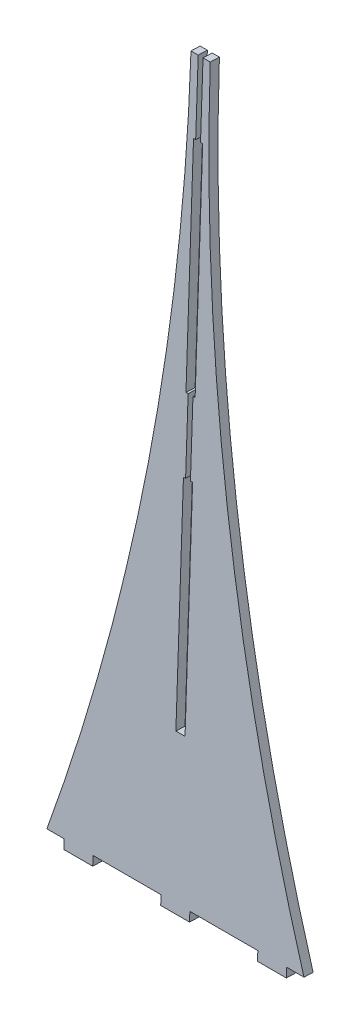
ISO-10303-21;
HEADER;
FILE_DESCRIPTION(('STEP AP214'),'2;1');
FILE_NAME('part.step','',(''),(''),'','','');
FILE_SCHEMA(('AUTOMOTIVE_DESIGN { 1 0 10303 214 1 1 1 1 }'));
ENDSEC;
DATA;
#1=APPLICATION_CONTEXT('core data for automotive mechanical design processes');
#2=APPLICATION_PROTOCOL_DEFINITION('international standard','automotive_design',2000,#1);
#3=PRODUCT_CONTEXT('',#1,'mechanical');
#4=PRODUCT('Part','Part','',(#3));
#5=PRODUCT_RELATED_PRODUCT_CATEGORY('part','',(#4));
#6=PRODUCT_DEFINITION_FORMATION('','',#4);
#7=PRODUCT_DEFINITION_CONTEXT('part definition',#1,'design');
#8=PRODUCT_DEFINITION('design','',#6,#7);
#9=PRODUCT_DEFINITION_SHAPE('','',#8);
#10=(LENGTH_UNIT() NAMED_UNIT(*) SI_UNIT(.MILLI.,.METRE.));
#11=(NAMED_UNIT(*) PLANE_ANGLE_UNIT() SI_UNIT($,.RADIAN.));
#12=(NAMED_UNIT(*) SI_UNIT($,.STERADIAN.) SOLID_ANGLE_UNIT());
#13=UNCERTAINTY_MEASURE_WITH_UNIT(LENGTH_MEASURE(1.E-05),#10,'distance_accuracy_value','');
#14=(GEOMETRIC_REPRESENTATION_CONTEXT(3) GLOBAL_UNCERTAINTY_ASSIGNED_CONTEXT((#13)) GLOBAL_UNIT_ASSIGNED_CONTEXT((#10,
#11,#12)) REPRESENTATION_CONTEXT('',''));
#15=CARTESIAN_POINT('',(0.,0.,0.));
#16=DIRECTION('',(0.,0.,1.));
#17=DIRECTION('',(1.,0.,0.));
#18=AXIS2_PLACEMENT_3D('',#15,#16,#17);
#19=CARTESIAN_POINT('',(-5.,-2.53322773530518,-72.4814190354541));
#20=DIRECTION('',(1.,0.,0.));
#21=DIRECTION('',(0.,0.,-1.));
#22=AXIS2_PLACEMENT_3D('',#19,#20,#21);
#23=PLANE('',#22);
#24=DIRECTION('',(0.,0.999389806676678,-0.0349287032503637));
#25=VECTOR('',#24,1.);
#26=CARTESIAN_POINT('',(-5.,-2.42232910248527,-69.3083563992557));
#27=LINE('',#26,#25);
#28=CARTESIAN_POINT('',(-5.,73.5709190938813,-71.9643226674216));
#29=VERTEX_POINT('',#28);
#30=CARTESIAN_POINT('',(-5.,76.7439817300797,-72.0752213002415));
#31=VERTEX_POINT('',#30);
#32=EDGE_CURVE('E278',#29,#31,#27,.T.);
#33=ORIENTED_EDGE('',*,*,#32,.T.);
#34=DIRECTION('',(0.,0.0349287032503637,0.999389806676678));
#35=VECTOR('',#34,1.);
#36=CARTESIAN_POINT('',(-5.,76.6330830972598,-75.24828393644));
#37=LINE('',#36,#35);
#38=CARTESIAN_POINT('',(-5.,76.6330830972598,-75.24828393644));
#39=VERTEX_POINT('',#38);
#40=EDGE_CURVE('E11',#39,#31,#37,.T.);
#41=ORIENTED_EDGE('',*,*,#40,.F.);
#42=DIRECTION('',(0.,0.999389806676678,-0.0349287032503637));
#43=VECTOR('',#42,1.);
#44=CARTESIAN_POINT('',(-5.,-2.53322773530518,-72.4814190354541));
#45=LINE('',#44,#43);
#46=CARTESIAN_POINT('',(-5.,73.4600204610614,-75.1373853036201));
#47=VERTEX_POINT('',#46);
#48=EDGE_CURVE('E352',#47,#39,#45,.T.);
#49=ORIENTED_EDGE('',*,*,#48,.F.);
#50=DIRECTION('',(0.,0.0349287032503637,0.999389806676678));
#51=VECTOR('',#50,1.);
#52=CARTESIAN_POINT('',(-5.,73.4600204610614,-75.1373853036201));
#53=LINE('',#52,#51);
#54=EDGE_CURVE('E273',#47,#29,#53,.T.);
#55=ORIENTED_EDGE('',*,*,#54,.T.);
#56=EDGE_LOOP('',(#33,#41,#49,#55));
#57=FACE_BOUND('',#56,.T.);
#58=ADVANCED_FACE('F36',(#57),#23,.F.);
#59=CARTESIAN_POINT('',(0.,76.6330830972598,-75.24828393644));
#60=DIRECTION('',(0.,0.999389806676678,-0.0349287032503637));
#61=DIRECTION('',(0.,0.0349287032503637,0.999389806676678));
#62=AXIS2_PLACEMENT_3D('',#59,#60,#61);
#63=PLANE('',#62);
#64=DIRECTION('',(-1.,0.,0.));
#65=VECTOR('',#64,1.);
#66=CARTESIAN_POINT('',(0.,76.7439817300797,-72.0752213002415));
#67=LINE('',#66,#65);
#68=CARTESIAN_POINT('',(-28.5714567803796,76.7439817300797,-72.0752213002415));
#69=VERTEX_POINT('',#68);
#70=EDGE_CURVE('E281',#31,#69,#67,.T.);
#71=ORIENTED_EDGE('',*,*,#70,.T.);
#72=DIRECTION('',(0.,0.0349287032503637,0.999389806676678));
#73=VECTOR('',#72,1.);
#74=CARTESIAN_POINT('',(-28.5714567803796,76.6330830972598,-75.24828393644));
#75=LINE('',#74,#73);
#76=CARTESIAN_POINT('',(-28.5714567803796,76.6330830972598,-75.24828393644));
#77=VERTEX_POINT('',#76);
#78=EDGE_CURVE('E44',#77,#69,#75,.T.);
#79=ORIENTED_EDGE('',*,*,#78,.F.);
#80=DIRECTION('',(-1.,0.,0.));
#81=VECTOR('',#80,1.);
#82=CARTESIAN_POINT('',(0.,76.6330830972598,-75.24828393644));
#83=LINE('',#82,#81);
#84=EDGE_CURVE('E167',#39,#77,#83,.T.);
#85=ORIENTED_EDGE('',*,*,#84,.F.);
#86=ORIENTED_EDGE('',*,*,#40,.T.);
#87=EDGE_LOOP('',(#71,#79,#85,#86));
#88=FACE_BOUND('',#87,.T.);
#89=ADVANCED_FACE('F426',(#88),#63,.F.);
#90=CARTESIAN_POINT('',(-28.5714567803796,-2.53322773530518,-72.4814190354541));
#91=DIRECTION('',(1.,0.,0.));
#92=DIRECTION('',(0.,0.,-1.));
#93=AXIS2_PLACEMENT_3D('',#90,#91,#92);
#94=PLANE('',#93);
#95=DIRECTION('',(0.,0.999389806676678,-0.0349287032503637));
#96=VECTOR('',#95,1.);
#97=CARTESIAN_POINT('',(-28.5714567803796,-2.42232910248527,-69.3083563992557));
#98=LINE('',#97,#96);
#99=CARTESIAN_POINT('',(-28.5714567803796,73.5709190938813,-71.9643226674216));
#100=VERTEX_POINT('',#99);
#101=EDGE_CURVE('E284',#100,#69,#98,.T.);
#102=ORIENTED_EDGE('',*,*,#101,.F.);
#103=DIRECTION('',(0.,0.0349287032503637,0.999389806676678));
#104=VECTOR('',#103,1.);
#105=CARTESIAN_POINT('',(-28.5714567803796,73.4600204610614,-75.1373853036201));
#106=LINE('',#105,#104);
#107=CARTESIAN_POINT('',(-28.5714567803796,73.4600204610614,-75.1373853036201));
#108=VERTEX_POINT('',#107);
#109=EDGE_CURVE('E419',#108,#100,#106,.T.);
#110=ORIENTED_EDGE('',*,*,#109,.F.);
#111=DIRECTION('',(0.,0.999389806676678,-0.0349287032503637));
#112=VECTOR('',#111,1.);
#113=CARTESIAN_POINT('',(-28.5714567803796,-2.53322773530518,-72.4814190354541));
#114=LINE('',#113,#112);
#115=EDGE_CURVE('E425',#108,#77,#114,.T.);
#116=ORIENTED_EDGE('',*,*,#115,.T.);
#117=ORIENTED_EDGE('',*,*,#78,.T.);
#118=EDGE_LOOP('',(#102,#110,#116,#117));
#119=FACE_BOUND('',#118,.T.);
#120=ADVANCED_FACE('F423',(#119),#94,.T.);
#121=CARTESIAN_POINT('',(0.,73.4600204610614,-75.1373853036201));
#122=DIRECTION('',(0.,-0.999389806676678,0.0349287032503637));
#123=DIRECTION('',(0.,-0.0349287032503637,-0.999389806676678));
#124=AXIS2_PLACEMENT_3D('',#121,#122,#123);
#125=PLANE('',#124);
#126=DIRECTION('',(1.,0.,0.));
#127=VECTOR('',#126,1.);
#128=CARTESIAN_POINT('',(0.,73.5709190938813,-71.9643226674216));
#129=LINE('',#128,#127);
#130=CARTESIAN_POINT('',(-38.5714567803796,73.5709190938813,-71.9643226674216));
#131=VERTEX_POINT('',#130);
#132=EDGE_CURVE('E288',#131,#100,#129,.T.);
#133=ORIENTED_EDGE('',*,*,#132,.F.);
#134=DIRECTION('',(0.,0.0349287032503637,0.999389806676678));
#135=VECTOR('',#134,1.);
#136=CARTESIAN_POINT('',(-38.5714567803796,73.4600204610614,-75.1373853036201));
#137=LINE('',#136,#135);
#138=CARTESIAN_POINT('',(-38.5714567803796,73.4600204610614,-75.1373853036201));
#139=VERTEX_POINT('',#138);
#140=EDGE_CURVE('E417',#139,#131,#137,.T.);
#141=ORIENTED_EDGE('',*,*,#140,.F.);
#142=DIRECTION('',(1.,0.,0.));
#143=VECTOR('',#142,1.);
#144=CARTESIAN_POINT('',(0.,73.4600204610614,-75.1373853036201));
#145=LINE('',#144,#143);
#146=EDGE_CURVE('E438',#139,#108,#145,.T.);
#147=ORIENTED_EDGE('',*,*,#146,.T.);
#148=ORIENTED_EDGE('',*,*,#109,.T.);
#149=EDGE_LOOP('',(#133,#141,#147,#148));
#150=FACE_BOUND('',#149,.T.);
#151=ADVANCED_FACE('F435',(#150),#125,.T.);
#152=CARTESIAN_POINT('',(-38.5714567803796,-2.53322773530518,-72.4814190354541));
#153=DIRECTION('',(-1.,0.,0.));
#154=DIRECTION('',(0.,0.,1.));
#155=AXIS2_PLACEMENT_3D('',#152,#153,#154);
#156=PLANE('',#155);
#157=DIRECTION('',(0.,-0.999389806676678,0.0349287032503637));
#158=VECTOR('',#157,1.);
#159=CARTESIAN_POINT('',(-38.5714567803796,-2.42232910248527,-69.3083563992557));
#160=LINE('',#159,#158);
#161=CARTESIAN_POINT('',(-38.5714567803796,76.7439817300797,-72.0752213002415));
#162=VERTEX_POINT('',#161);
#163=EDGE_CURVE('E291',#162,#131,#160,.T.);
#164=ORIENTED_EDGE('',*,*,#163,.F.);
#165=DIRECTION('',(0.,0.0349287032503637,0.999389806676678));
#166=VECTOR('',#165,1.);
#167=CARTESIAN_POINT('',(-38.5714567803796,76.6330830972598,-75.24828393644));
#168=LINE('',#167,#166);
#169=CARTESIAN_POINT('',(-38.5714567803796,76.6330830972598,-75.24828393644));
#170=VERTEX_POINT('',#169);
#171=EDGE_CURVE('E415',#170,#162,#168,.T.);
#172=ORIENTED_EDGE('',*,*,#171,.F.);
#173=DIRECTION('',(0.,-0.999389806676678,0.0349287032503637));
#174=VECTOR('',#173,1.);
#175=CARTESIAN_POINT('',(-38.5714567803796,-2.53322773530518,-72.4814190354541));
#176=LINE('',#175,#174);
#177=EDGE_CURVE('E442',#170,#139,#176,.T.);
#178=ORIENTED_EDGE('',*,*,#177,.T.);
#179=ORIENTED_EDGE('',*,*,#140,.T.);
#180=EDGE_LOOP('',(#164,#172,#178,#179));
#181=FACE_BOUND('',#180,.T.);
#182=ADVANCED_FACE('F533',(#181),#156,.T.);
#183=CARTESIAN_POINT('',(-44.5714567803795,76.7439817300797,-72.0752213002415));
#184=VERTEX_POINT('',#183);
#185=EDGE_CURVE('E285',#162,#184,#67,.T.);
#186=ORIENTED_EDGE('',*,*,#185,.T.);
#187=DIRECTION('',(0.,0.0349287032503637,0.999389806676678));
#188=VECTOR('',#187,1.);
#189=CARTESIAN_POINT('',(-44.5714567803795,76.6330830972598,-75.24828393644));
#190=LINE('',#189,#188);
#191=CARTESIAN_POINT('',(-44.5714567803795,76.6330830972598,-75.24828393644));
#192=VERTEX_POINT('',#191);
#193=EDGE_CURVE('E412',#192,#184,#190,.T.);
#194=ORIENTED_EDGE('',*,*,#193,.F.);
#195=EDGE_CURVE('E445',#170,#192,#83,.T.);
#196=ORIENTED_EDGE('',*,*,#195,.F.);
#197=ORIENTED_EDGE('',*,*,#171,.T.);
#198=EDGE_LOOP('',(#186,#194,#196,#197));
#199=FACE_BOUND('',#198,.T.);
#200=ADVANCED_FACE('F525',(#199),#63,.F.);
#201=CARTESIAN_POINT('',(-781.824991919702,326.480534766429,-83.9804597490309));
#202=DIRECTION('',(0.,0.0349287032503637,0.999389806676678));
#203=DIRECTION('',(0.,-0.999389806676678,0.0349287032503637));
#204=AXIS2_PLACEMENT_3D('',#201,#202,#203);
#205=CYLINDRICAL_SURFACE('',#204,778.487491919702);
#206=CARTESIAN_POINT('',(-781.824991919702,326.591433399249,-80.8073971128324));
#207=DIRECTION('',(0.,-0.0349287032503637,-0.999389806676678));
#208=DIRECTION('',(0.,0.999389806676678,-0.0349287032503637));
#209=AXIS2_PLACEMENT_3D('',#206,#207,#208);
#210=CIRCLE('',#209,778.487491919702);
#211=CARTESIAN_POINT('',(-3.3375,326.591433399249,-80.8073971128324));
#212=VERTEX_POINT('',#211);
#213=EDGE_CURVE('E294',#184,#212,#210,.F.);
#214=ORIENTED_EDGE('',*,*,#213,.T.);
#215=DIRECTION('',(0.,0.0349287032503637,0.999389806676678));
#216=VECTOR('',#215,1.);
#217=CARTESIAN_POINT('',(-3.3375,326.480534766429,-83.9804597490309));
#218=LINE('',#217,#216);
#219=CARTESIAN_POINT('',(-3.3375,326.480534766429,-83.9804597490309));
#220=VERTEX_POINT('',#219);
#221=EDGE_CURVE('E409',#220,#212,#218,.T.);
#222=ORIENTED_EDGE('',*,*,#221,.F.);
#223=CARTESIAN_POINT('',(-781.824991919702,326.480534766429,-83.9804597490309));
#224=DIRECTION('',(0.,-0.0349287032503637,-0.999389806676678));
#225=DIRECTION('',(0.,0.999389806676678,-0.0349287032503637));
#226=AXIS2_PLACEMENT_3D('',#223,#224,#225);
#227=CIRCLE('',#226,778.487491919702);
#228=EDGE_CURVE('E449',#192,#220,#227,.F.);
#229=ORIENTED_EDGE('',*,*,#228,.F.);
#230=ORIENTED_EDGE('',*,*,#193,.T.);
#231=EDGE_LOOP('',(#214,#222,#229,#230));
#232=FACE_BOUND('',#231,.T.);
#233=ADVANCED_FACE('F532',(#232),#205,.F.);
#234=CARTESIAN_POINT('',(0.,326.480534766429,-83.9804597490309));
#235=DIRECTION('',(0.,-0.999389806676678,0.0349287032503637));
#236=DIRECTION('',(0.,-0.0349287032503637,-0.999389806676678));
#237=AXIS2_PLACEMENT_3D('',#234,#235,#236);
#238=PLANE('',#237);
#239=DIRECTION('',(1.,0.,0.));
#240=VECTOR('',#239,1.);
#241=CARTESIAN_POINT('',(0.,326.591433399249,-80.8073971128324));
#242=LINE('',#241,#240);
#243=CARTESIAN_POINT('',(-0.8375,326.591433399249,-80.8073971128324));
#244=VERTEX_POINT('',#243);
#245=EDGE_CURVE('E296',#212,#244,#242,.T.);
#246=ORIENTED_EDGE('',*,*,#245,.T.);
#247=DIRECTION('',(0.,0.0349287032503637,0.999389806676678));
#248=VECTOR('',#247,1.);
#249=CARTESIAN_POINT('',(-0.8375,326.480534766429,-83.9804597490309));
#250=LINE('',#249,#248);
#251=CARTESIAN_POINT('',(-0.8375,326.480534766429,-83.9804597490309));
#252=VERTEX_POINT('',#251);
#253=EDGE_CURVE('E406',#252,#244,#250,.T.);
#254=ORIENTED_EDGE('',*,*,#253,.F.);
#255=DIRECTION('',(1.,0.,0.));
#256=VECTOR('',#255,1.);
#257=CARTESIAN_POINT('',(0.,326.480534766429,-83.9804597490309));
#258=LINE('',#257,#256);
#259=EDGE_CURVE('E451',#220,#252,#258,.T.);
#260=ORIENTED_EDGE('',*,*,#259,.F.);
#261=ORIENTED_EDGE('',*,*,#221,.T.);
#262=EDGE_LOOP('',(#246,#254,#260,#261));
#263=FACE_BOUND('',#262,.T.);
#264=ADVANCED_FACE('F539',(#263),#238,.F.);
#265=CARTESIAN_POINT('',(-0.837500000000037,-2.53322773530518,-72.4814190354541));
#266=DIRECTION('',(-1.,0.,0.));
#267=DIRECTION('',(0.,-1.,0.));
#268=AXIS2_PLACEMENT_3D('',#265,#266,#267);
#269=PLANE('',#268);
#270=DIRECTION('',(0.,-0.999389806676678,0.0349287032503637));
#271=VECTOR('',#270,1.);
#272=CARTESIAN_POINT('',(-0.837500000000037,-2.42232910248527,-69.3083563992557));
#273=LINE('',#272,#271);
#274=CARTESIAN_POINT('',(-0.837500000000003,301.606688232332,-79.9341795315733));
#275=VERTEX_POINT('',#274);
#276=EDGE_CURVE('E298',#244,#275,#273,.T.);
#277=ORIENTED_EDGE('',*,*,#276,.T.);
#278=DIRECTION('',(0.,0.0349287032503637,0.999389806676678));
#279=VECTOR('',#278,1.);
#280=CARTESIAN_POINT('',(-0.837500000000003,301.495789599513,-83.1072421677718));
#281=LINE('',#280,#279);
#282=CARTESIAN_POINT('',(-0.837500000000003,301.495789599513,-83.1072421677718));
#283=VERTEX_POINT('',#282);
#284=EDGE_CURVE('E403',#283,#275,#281,.T.);
#285=ORIENTED_EDGE('',*,*,#284,.F.);
#286=DIRECTION('',(0.,-0.999389806676678,0.0349287032503637));
#287=VECTOR('',#286,1.);
#288=CARTESIAN_POINT('',(-0.837500000000037,-2.53322773530518,-72.4814190354541));
#289=LINE('',#288,#287);
#290=EDGE_CURVE('E453',#252,#283,#289,.T.);
#291=ORIENTED_EDGE('',*,*,#290,.F.);
#292=ORIENTED_EDGE('',*,*,#253,.T.);
#293=EDGE_LOOP('',(#277,#285,#291,#292));
#294=FACE_BOUND('',#293,.T.);
#295=ADVANCED_FACE('F555',(#294),#269,.F.);
#296=CARTESIAN_POINT('',(-2.25033895054024E-11,301.495789599513,-83.1072421677718));
#297=DIRECTION('',(0.,0.999389806676678,-0.0349287032503637));
#298=DIRECTION('',(0.,0.0349287032503637,0.999389806676678));
#299=AXIS2_PLACEMENT_3D('',#296,#297,#298);
#300=PLANE('',#299);
#301=DIRECTION('',(-1.,0.,0.));
#302=VECTOR('',#301,1.);
#303=CARTESIAN_POINT('',(-2.25033895054024E-11,301.606688232332,-79.9341795315733));
#304=LINE('',#303,#302);
#305=CARTESIAN_POINT('',(-1.5875,301.606688232332,-79.9341795315733));
#306=VERTEX_POINT('',#305);
#307=EDGE_CURVE('E300',#275,#306,#304,.T.);
#308=ORIENTED_EDGE('',*,*,#307,.T.);
#309=DIRECTION('',(0.,0.0349287032503637,0.999389806676678));
#310=VECTOR('',#309,1.);
#311=CARTESIAN_POINT('',(-1.5875,301.495789599513,-83.1072421677718));
#312=LINE('',#311,#310);
#313=CARTESIAN_POINT('',(-1.5875,301.495789599513,-83.1072421677718));
#314=VERTEX_POINT('',#313);
#315=EDGE_CURVE('E400',#314,#306,#312,.T.);
#316=ORIENTED_EDGE('',*,*,#315,.F.);
#317=DIRECTION('',(-1.,0.,0.));
#318=VECTOR('',#317,1.);
#319=CARTESIAN_POINT('',(-2.25033895054024E-11,301.495789599513,-83.1072421677718));
#320=LINE('',#319,#318);
#321=EDGE_CURVE('E455',#283,#314,#320,.T.);
#322=ORIENTED_EDGE('',*,*,#321,.F.);
#323=ORIENTED_EDGE('',*,*,#284,.T.);
#324=EDGE_LOOP('',(#308,#316,#322,#323));
#325=FACE_BOUND('',#324,.T.);
#326=ADVANCED_FACE('F562',(#325),#300,.F.);
#327=CARTESIAN_POINT('',(-1.5875,-2.53322773530518,-72.4814190354541));
#328=DIRECTION('',(-1.,0.,0.));
#329=DIRECTION('',(0.,0.,1.));
#330=AXIS2_PLACEMENT_3D('',#327,#328,#329);
#331=PLANE('',#330);
#332=DIRECTION('',(0.,-0.999389806676678,0.0349287032503637));
#333=VECTOR('',#332,1.);
#334=CARTESIAN_POINT('',(-1.5875,-2.42232910248527,-69.3083563992557));
#335=LINE('',#334,#333);
#336=CARTESIAN_POINT('',(-1.5875,226.652452731581,-77.3145267877961));
#337=VERTEX_POINT('',#336);
#338=EDGE_CURVE('E302',#306,#337,#335,.T.);
#339=ORIENTED_EDGE('',*,*,#338,.T.);
#340=DIRECTION('',(0.,0.0349287032503637,0.999389806676678));
#341=VECTOR('',#340,1.);
#342=CARTESIAN_POINT('',(-1.5875,226.541554098762,-80.4875894239945));
#343=LINE('',#342,#341);
#344=CARTESIAN_POINT('',(-1.5875,226.541554098762,-80.4875894239945));
#345=VERTEX_POINT('',#344);
#346=EDGE_CURVE('E397',#345,#337,#343,.T.);
#347=ORIENTED_EDGE('',*,*,#346,.F.);
#348=DIRECTION('',(0.,-0.999389806676678,0.0349287032503637));
#349=VECTOR('',#348,1.);
#350=CARTESIAN_POINT('',(-1.5875,-2.53322773530518,-72.4814190354541));
#351=LINE('',#350,#349);
#352=EDGE_CURVE('E457',#314,#345,#351,.T.);
#353=ORIENTED_EDGE('',*,*,#352,.F.);
#354=ORIENTED_EDGE('',*,*,#315,.T.);
#355=EDGE_LOOP('',(#339,#347,#353,#354));
#356=FACE_BOUND('',#355,.T.);
#357=ADVANCED_FACE('F565',(#356),#331,.F.);
#358=CARTESIAN_POINT('',(0.,226.541554098762,-80.4875894239945));
#359=DIRECTION('',(0.,-0.999389806676678,0.0349287032503637));
#360=DIRECTION('',(0.,-0.0349287032503637,-0.999389806676678));
#361=AXIS2_PLACEMENT_3D('',#358,#359,#360);
#362=PLANE('',#361);
#363=DIRECTION('',(1.,0.,0.));
#364=VECTOR('',#363,1.);
#365=CARTESIAN_POINT('',(0.,226.652452731581,-77.3145267877961));
#366=LINE('',#365,#364);
#367=CARTESIAN_POINT('',(-0.837499999999988,226.652452731581,-77.3145267877961));
#368=VERTEX_POINT('',#367);
#369=EDGE_CURVE('E304',#337,#368,#366,.T.);
#370=ORIENTED_EDGE('',*,*,#369,.T.);
#371=DIRECTION('',(0.,0.0349287032503637,0.999389806676678));
#372=VECTOR('',#371,1.);
#373=CARTESIAN_POINT('',(-0.837499999999988,226.541554098762,-80.4875894239945));
#374=LINE('',#373,#372);
#375=CARTESIAN_POINT('',(-0.837499999999988,226.541554098762,-80.4875894239945));
#376=VERTEX_POINT('',#375);
#377=EDGE_CURVE('E394',#376,#368,#374,.T.);
#378=ORIENTED_EDGE('',*,*,#377,.F.);
#379=DIRECTION('',(1.,0.,0.));
#380=VECTOR('',#379,1.);
#381=CARTESIAN_POINT('',(0.,226.541554098762,-80.4875894239945));
#382=LINE('',#381,#380);
#383=EDGE_CURVE('E459',#345,#376,#382,.T.);
#384=ORIENTED_EDGE('',*,*,#383,.F.);
#385=ORIENTED_EDGE('',*,*,#346,.T.);
#386=EDGE_LOOP('',(#370,#378,#384,#385));
#387=FACE_BOUND('',#386,.T.);
#388=ADVANCED_FACE('F570',(#387),#362,.F.);
#389=CARTESIAN_POINT('',(-0.83749999999996,-2.53322773530518,-72.4814190354541));
#390=DIRECTION('',(-1.,0.,0.));
#391=DIRECTION('',(0.,-1.,0.));
#392=AXIS2_PLACEMENT_3D('',#389,#390,#391);
#393=PLANE('',#392);
#394=DIRECTION('',(0.,-0.999389806676678,0.0349287032503637));
#395=VECTOR('',#394,1.);
#396=CARTESIAN_POINT('',(-0.83749999999996,-2.42232910248527,-69.3083563992557));
#397=LINE('',#396,#395);
#398=CARTESIAN_POINT('',(-0.837499999999985,201.667707564665,-76.441309206537));
#399=VERTEX_POINT('',#398);
#400=EDGE_CURVE('E306',#368,#399,#397,.T.);
#401=ORIENTED_EDGE('',*,*,#400,.T.);
#402=DIRECTION('',(0.,0.0349287032503637,0.999389806676678));
#403=VECTOR('',#402,1.);
#404=CARTESIAN_POINT('',(-0.837499999999985,201.556808931845,-79.6143718427354));
#405=LINE('',#404,#403);
#406=CARTESIAN_POINT('',(-0.837499999999985,201.556808931845,-79.6143718427354));
#407=VERTEX_POINT('',#406);
#408=EDGE_CURVE('E391',#407,#399,#405,.T.);
#409=ORIENTED_EDGE('',*,*,#408,.F.);
#410=DIRECTION('',(0.,-0.999389806676678,0.0349287032503637));
#411=VECTOR('',#410,1.);
#412=CARTESIAN_POINT('',(-0.83749999999996,-2.53322773530518,-72.4814190354541));
#413=LINE('',#412,#411);
#414=EDGE_CURVE('E461',#376,#407,#413,.T.);
#415=ORIENTED_EDGE('',*,*,#414,.F.);
#416=ORIENTED_EDGE('',*,*,#377,.T.);
#417=EDGE_LOOP('',(#401,#409,#415,#416));
#418=FACE_BOUND('',#417,.T.);
#419=ADVANCED_FACE('F576',(#418),#393,.F.);
#420=CARTESIAN_POINT('',(0.,201.556808931845,-79.6143718427354));
#421=DIRECTION('',(0.,0.999389806676678,-0.0349287032503637));
#422=DIRECTION('',(0.,0.0349287032503637,0.999389806676678));
#423=AXIS2_PLACEMENT_3D('',#420,#421,#422);
#424=PLANE('',#423);
#425=DIRECTION('',(-1.,0.,0.));
#426=VECTOR('',#425,1.);
#427=CARTESIAN_POINT('',(0.,201.667707564665,-76.441309206537));
#428=LINE('',#427,#426);
#429=CARTESIAN_POINT('',(-1.5875,201.667707564665,-76.441309206537));
#430=VERTEX_POINT('',#429);
#431=EDGE_CURVE('E308',#399,#430,#428,.T.);
#432=ORIENTED_EDGE('',*,*,#431,.T.);
#433=DIRECTION('',(0.,0.0349287032503637,0.999389806676678));
#434=VECTOR('',#433,1.);
#435=CARTESIAN_POINT('',(-1.5875,201.556808931845,-79.6143718427354));
#436=LINE('',#435,#434);
#437=CARTESIAN_POINT('',(-1.5875,201.556808931845,-79.6143718427354));
#438=VERTEX_POINT('',#437);
#439=EDGE_CURVE('E388',#438,#430,#436,.T.);
#440=ORIENTED_EDGE('',*,*,#439,.F.);
#441=DIRECTION('',(-1.,0.,0.));
#442=VECTOR('',#441,1.);
#443=CARTESIAN_POINT('',(0.,201.556808931845,-79.6143718427354));
#444=LINE('',#443,#442);
#445=EDGE_CURVE('E463',#407,#438,#444,.T.);
#446=ORIENTED_EDGE('',*,*,#445,.F.);
#447=ORIENTED_EDGE('',*,*,#408,.T.);
#448=EDGE_LOOP('',(#432,#440,#446,#447));
#449=FACE_BOUND('',#448,.T.);
#450=ADVANCED_FACE('F580',(#449),#424,.F.);
#451=CARTESIAN_POINT('',(-1.5875,-2.53322773530518,-72.4814190354541));
#452=DIRECTION('',(-1.,0.,0.));
#453=DIRECTION('',(0.,0.,1.));
#454=AXIS2_PLACEMENT_3D('',#451,#452,#453);
#455=PLANE('',#454);
#456=DIRECTION('',(0.,-0.999389806676678,0.0349287032503637));
#457=VECTOR('',#456,1.);
#458=CARTESIAN_POINT('',(-1.5875,-2.42232910248527,-69.3083563992557));
#459=LINE('',#458,#457);
#460=CARTESIAN_POINT('',(-1.5875,126.713472063914,-73.8216564627597));
#461=VERTEX_POINT('',#460);
#462=EDGE_CURVE('E310',#430,#461,#459,.T.);
#463=ORIENTED_EDGE('',*,*,#462,.T.);
#464=DIRECTION('',(0.,0.0349287032503637,0.999389806676678));
#465=VECTOR('',#464,1.);
#466=CARTESIAN_POINT('',(-1.5875,126.602573431094,-76.9947190989582));
#467=LINE('',#466,#465);
#468=CARTESIAN_POINT('',(-1.5875,126.602573431094,-76.9947190989582));
#469=VERTEX_POINT('',#468);
#470=EDGE_CURVE('E385',#469,#461,#467,.T.);
#471=ORIENTED_EDGE('',*,*,#470,.F.);
#472=DIRECTION('',(0.,-0.999389806676678,0.0349287032503637));
#473=VECTOR('',#472,1.);
#474=CARTESIAN_POINT('',(-1.5875,-2.53322773530518,-72.4814190354541));
#475=LINE('',#474,#473);
#476=EDGE_CURVE('E465',#438,#469,#475,.T.);
#477=ORIENTED_EDGE('',*,*,#476,.F.);
#478=ORIENTED_EDGE('',*,*,#439,.T.);
#479=EDGE_LOOP('',(#463,#471,#477,#478));
#480=FACE_BOUND('',#479,.T.);
#481=ADVANCED_FACE('F585',(#480),#455,.F.);
#482=CARTESIAN_POINT('',(0.,126.602573431094,-76.9947190989582));
#483=DIRECTION('',(0.,-0.999389806676678,0.0349287032503637));
#484=DIRECTION('',(0.,-0.0349287032503637,-0.999389806676678));
#485=AXIS2_PLACEMENT_3D('',#482,#483,#484);
#486=PLANE('',#485);
#487=DIRECTION('',(1.,0.,0.));
#488=VECTOR('',#487,1.);
#489=CARTESIAN_POINT('',(0.,126.713472063914,-73.8216564627597));
#490=LINE('',#489,#488);
#491=CARTESIAN_POINT('',(1.5875,126.713472063914,-73.8216564627597));
#492=VERTEX_POINT('',#491);
#493=EDGE_CURVE('E312',#461,#492,#490,.T.);
#494=ORIENTED_EDGE('',*,*,#493,.T.);
#495=DIRECTION('',(0.,0.0349287032503637,0.999389806676678));
#496=VECTOR('',#495,1.);
#497=CARTESIAN_POINT('',(1.5875,126.602573431094,-76.9947190989582));
#498=LINE('',#497,#496);
#499=CARTESIAN_POINT('',(1.5875,126.602573431094,-76.9947190989582));
#500=VERTEX_POINT('',#499);
#501=EDGE_CURVE('E383',#500,#492,#498,.T.);
#502=ORIENTED_EDGE('',*,*,#501,.F.);
#503=DIRECTION('',(1.,0.,0.));
#504=VECTOR('',#503,1.);
#505=CARTESIAN_POINT('',(0.,126.602573431094,-76.9947190989582));
#506=LINE('',#505,#504);
#507=EDGE_CURVE('E467',#469,#500,#506,.T.);
#508=ORIENTED_EDGE('',*,*,#507,.F.);
#509=ORIENTED_EDGE('',*,*,#470,.T.);
#510=EDGE_LOOP('',(#494,#502,#508,#509));
#511=FACE_BOUND('',#510,.T.);
#512=ADVANCED_FACE('F591',(#511),#486,.F.);
#513=CARTESIAN_POINT('',(1.5875,-2.53322773530518,-72.4814190354541));
#514=DIRECTION('',(-1.,0.,0.));
#515=DIRECTION('',(0.,0.,1.));
#516=AXIS2_PLACEMENT_3D('',#513,#514,#515);
#517=PLANE('',#516);
#518=DIRECTION('',(0.,-0.999389806676678,0.0349287032503637));
#519=VECTOR('',#518,1.);
#520=CARTESIAN_POINT('',(1.5875,-2.42232910248527,-69.3083563992557));
#521=LINE('',#520,#519);
#522=CARTESIAN_POINT('',(1.5875,201.667707564665,-76.441309206537));
#523=VERTEX_POINT('',#522);
#524=EDGE_CURVE('E315',#523,#492,#521,.T.);
#525=ORIENTED_EDGE('',*,*,#524,.F.);
#526=DIRECTION('',(0.,0.0349287032503637,0.999389806676678));
#527=VECTOR('',#526,1.);
#528=CARTESIAN_POINT('',(1.5875,201.556808931845,-79.6143718427354));
#529=LINE('',#528,#527);
#530=CARTESIAN_POINT('',(1.5875,201.556808931845,-79.6143718427354));
#531=VERTEX_POINT('',#530);
#532=EDGE_CURVE('E381',#531,#523,#529,.T.);
#533=ORIENTED_EDGE('',*,*,#532,.F.);
#534=DIRECTION('',(0.,-0.999389806676678,0.0349287032503637));
#535=VECTOR('',#534,1.);
#536=CARTESIAN_POINT('',(1.5875,-2.53322773530518,-72.4814190354541));
#537=LINE('',#536,#535);
#538=EDGE_CURVE('E469',#531,#500,#537,.T.);
#539=ORIENTED_EDGE('',*,*,#538,.T.);
#540=ORIENTED_EDGE('',*,*,#501,.T.);
#541=EDGE_LOOP('',(#525,#533,#539,#540));
#542=FACE_BOUND('',#541,.T.);
#543=ADVANCED_FACE('F595',(#542),#517,.T.);
#544=CARTESIAN_POINT('',(0.,201.556808931845,-79.6143718427354));
#545=DIRECTION('',(0.,-0.999389806676678,0.0349287032503637));
#546=DIRECTION('',(0.,-0.0349287032503637,-0.999389806676678));
#547=AXIS2_PLACEMENT_3D('',#544,#545,#546);
#548=PLANE('',#547);
#549=DIRECTION('',(1.,0.,0.));
#550=VECTOR('',#549,1.);
#551=CARTESIAN_POINT('',(0.,201.667707564665,-76.441309206537));
#552=LINE('',#551,#550);
#553=CARTESIAN_POINT('',(0.837499999999985,201.667707564665,-76.441309206537));
#554=VERTEX_POINT('',#553);
#555=EDGE_CURVE('E318',#554,#523,#552,.T.);
#556=ORIENTED_EDGE('',*,*,#555,.F.);
#557=DIRECTION('',(0.,0.0349287032503637,0.999389806676678));
#558=VECTOR('',#557,1.);
#559=CARTESIAN_POINT('',(0.837499999999985,201.556808931845,-79.6143718427354));
#560=LINE('',#559,#558);
#561=CARTESIAN_POINT('',(0.837499999999985,201.556808931845,-79.6143718427354));
#562=VERTEX_POINT('',#561);
#563=EDGE_CURVE('E379',#562,#554,#560,.T.);
#564=ORIENTED_EDGE('',*,*,#563,.F.);
#565=DIRECTION('',(1.,0.,0.));
#566=VECTOR('',#565,1.);
#567=CARTESIAN_POINT('',(0.,201.556808931845,-79.6143718427354));
#568=LINE('',#567,#566);
#569=EDGE_CURVE('E472',#562,#531,#568,.T.);
#570=ORIENTED_EDGE('',*,*,#569,.T.);
#571=ORIENTED_EDGE('',*,*,#532,.T.);
#572=EDGE_LOOP('',(#556,#564,#570,#571));
#573=FACE_BOUND('',#572,.T.);
#574=ADVANCED_FACE('F598',(#573),#548,.T.);
#575=CARTESIAN_POINT('',(0.83749999999996,-2.53322773530518,-72.4814190354541));
#576=DIRECTION('',(-1.,0.,0.));
#577=DIRECTION('',(0.,-1.,0.));
#578=AXIS2_PLACEMENT_3D('',#575,#576,#577);
#579=PLANE('',#578);
#580=DIRECTION('',(0.,-0.999389806676678,0.0349287032503637));
#581=VECTOR('',#580,1.);
#582=CARTESIAN_POINT('',(0.83749999999996,-2.42232910248527,-69.3083563992557));
#583=LINE('',#582,#581);
#584=CARTESIAN_POINT('',(0.837499999999988,226.652452731581,-77.3145267877961));
#585=VERTEX_POINT('',#584);
#586=EDGE_CURVE('E321',#585,#554,#583,.T.);
#587=ORIENTED_EDGE('',*,*,#586,.F.);
#588=DIRECTION('',(0.,0.0349287032503637,0.999389806676678));
#589=VECTOR('',#588,1.);
#590=CARTESIAN_POINT('',(0.837499999999988,226.541554098762,-80.4875894239945));
#591=LINE('',#590,#589);
#592=CARTESIAN_POINT('',(0.837499999999988,226.541554098762,-80.4875894239945));
#593=VERTEX_POINT('',#592);
#594=EDGE_CURVE('E377',#593,#585,#591,.T.);
#595=ORIENTED_EDGE('',*,*,#594,.F.);
#596=DIRECTION('',(0.,-0.999389806676678,0.0349287032503637));
#597=VECTOR('',#596,1.);
#598=CARTESIAN_POINT('',(0.83749999999996,-2.53322773530518,-72.4814190354541));
#599=LINE('',#598,#597);
#600=EDGE_CURVE('E475',#593,#562,#599,.T.);
#601=ORIENTED_EDGE('',*,*,#600,.T.);
#602=ORIENTED_EDGE('',*,*,#563,.T.);
#603=EDGE_LOOP('',(#587,#595,#601,#602));
#604=FACE_BOUND('',#603,.T.);
#605=ADVANCED_FACE('F603',(#604),#579,.T.);
#606=CARTESIAN_POINT('',(0.,226.541554098762,-80.4875894239945));
#607=DIRECTION('',(0.,0.999389806676678,-0.0349287032503637));
#608=DIRECTION('',(0.,0.0349287032503637,0.999389806676678));
#609=AXIS2_PLACEMENT_3D('',#606,#607,#608);
#610=PLANE('',#609);
#611=DIRECTION('',(-1.,0.,0.));
#612=VECTOR('',#611,1.);
#613=CARTESIAN_POINT('',(0.,226.652452731581,-77.3145267877961));
#614=LINE('',#613,#612);
#615=CARTESIAN_POINT('',(1.5875,226.652452731581,-77.3145267877961));
#616=VERTEX_POINT('',#615);
#617=EDGE_CURVE('E324',#616,#585,#614,.T.);
#618=ORIENTED_EDGE('',*,*,#617,.F.);
#619=DIRECTION('',(0.,0.0349287032503637,0.999389806676678));
#620=VECTOR('',#619,1.);
#621=CARTESIAN_POINT('',(1.5875,226.541554098762,-80.4875894239945));
#622=LINE('',#621,#620);
#623=CARTESIAN_POINT('',(1.5875,226.541554098762,-80.4875894239945));
#624=VERTEX_POINT('',#623);
#625=EDGE_CURVE('E375',#624,#616,#622,.T.);
#626=ORIENTED_EDGE('',*,*,#625,.F.);
#627=DIRECTION('',(-1.,0.,0.));
#628=VECTOR('',#627,1.);
#629=CARTESIAN_POINT('',(0.,226.541554098762,-80.4875894239945));
#630=LINE('',#629,#628);
#631=EDGE_CURVE('E478',#624,#593,#630,.T.);
#632=ORIENTED_EDGE('',*,*,#631,.T.);
#633=ORIENTED_EDGE('',*,*,#594,.T.);
#634=EDGE_LOOP('',(#618,#626,#632,#633));
#635=FACE_BOUND('',#634,.T.);
#636=ADVANCED_FACE('F606',(#635),#610,.T.);
#637=CARTESIAN_POINT('',(1.5875,-2.53322773530518,-72.4814190354541));
#638=DIRECTION('',(-1.,0.,0.));
#639=DIRECTION('',(0.,0.,1.));
#640=AXIS2_PLACEMENT_3D('',#637,#638,#639);
#641=PLANE('',#640);
#642=DIRECTION('',(0.,-0.999389806676678,0.0349287032503637));
#643=VECTOR('',#642,1.);
#644=CARTESIAN_POINT('',(1.5875,-2.42232910248527,-69.3083563992557));
#645=LINE('',#644,#643);
#646=CARTESIAN_POINT('',(1.5875,301.606688232332,-79.9341795315733));
#647=VERTEX_POINT('',#646);
#648=EDGE_CURVE('E327',#647,#616,#645,.T.);
#649=ORIENTED_EDGE('',*,*,#648,.F.);
#650=DIRECTION('',(0.,0.0349287032503637,0.999389806676678));
#651=VECTOR('',#650,1.);
#652=CARTESIAN_POINT('',(1.5875,301.495789599513,-83.1072421677718));
#653=LINE('',#652,#651);
#654=CARTESIAN_POINT('',(1.5875,301.495789599513,-83.1072421677718));
#655=VERTEX_POINT('',#654);
#656=EDGE_CURVE('E373',#655,#647,#653,.T.);
#657=ORIENTED_EDGE('',*,*,#656,.F.);
#658=DIRECTION('',(0.,-0.999389806676678,0.0349287032503637));
#659=VECTOR('',#658,1.);
#660=CARTESIAN_POINT('',(1.5875,-2.53322773530518,-72.4814190354541));
#661=LINE('',#660,#659);
#662=EDGE_CURVE('E481',#655,#624,#661,.T.);
#663=ORIENTED_EDGE('',*,*,#662,.T.);
#664=ORIENTED_EDGE('',*,*,#625,.T.);
#665=EDGE_LOOP('',(#649,#657,#663,#664));
#666=FACE_BOUND('',#665,.T.);
#667=ADVANCED_FACE('F611',(#666),#641,.T.);
#668=CARTESIAN_POINT('',(2.2501945854501E-11,301.495789599513,-83.1072421677718));
#669=DIRECTION('',(0.,-0.999389806676678,0.0349287032503637));
#670=DIRECTION('',(0.,-0.0349287032503637,-0.999389806676678));
#671=AXIS2_PLACEMENT_3D('',#668,#669,#670);
#672=PLANE('',#671);
#673=DIRECTION('',(1.,0.,0.));
#674=VECTOR('',#673,1.);
#675=CARTESIAN_POINT('',(2.2501945854501E-11,301.606688232332,-79.9341795315733));
#676=LINE('',#675,#674);
#677=CARTESIAN_POINT('',(0.837499999999997,301.606688232332,-79.9341795315733));
#678=VERTEX_POINT('',#677);
#679=EDGE_CURVE('E330',#678,#647,#676,.T.);
#680=ORIENTED_EDGE('',*,*,#679,.F.);
#681=DIRECTION('',(0.,0.0349287032503637,0.999389806676678));
#682=VECTOR('',#681,1.);
#683=CARTESIAN_POINT('',(0.837499999999997,301.495789599513,-83.1072421677718));
#684=LINE('',#683,#682);
#685=CARTESIAN_POINT('',(0.837499999999997,301.495789599513,-83.1072421677718));
#686=VERTEX_POINT('',#685);
#687=EDGE_CURVE('E371',#686,#678,#684,.T.);
#688=ORIENTED_EDGE('',*,*,#687,.F.);
#689=DIRECTION('',(1.,0.,0.));
#690=VECTOR('',#689,1.);
#691=CARTESIAN_POINT('',(2.2501945854501E-11,301.495789599513,-83.1072421677718));
#692=LINE('',#691,#690);
#693=EDGE_CURVE('E484',#686,#655,#692,.T.);
#694=ORIENTED_EDGE('',*,*,#693,.T.);
#695=ORIENTED_EDGE('',*,*,#656,.T.);
#696=EDGE_LOOP('',(#680,#688,#694,#695));
#697=FACE_BOUND('',#696,.T.);
#698=ADVANCED_FACE('F614',(#697),#672,.T.);
#699=CARTESIAN_POINT('',(0.837499999999957,-2.53322773530518,-72.4814190354541));
#700=DIRECTION('',(-1.,0.,0.));
#701=DIRECTION('',(0.,-1.,0.));
#702=AXIS2_PLACEMENT_3D('',#699,#700,#701);
#703=PLANE('',#702);
#704=DIRECTION('',(0.,-0.999389806676678,0.0349287032503637));
#705=VECTOR('',#704,1.);
#706=CARTESIAN_POINT('',(0.837499999999957,-2.42232910248527,-69.3083563992557));
#707=LINE('',#706,#705);
#708=CARTESIAN_POINT('',(0.8375,326.591433399249,-80.8073971128324));
#709=VERTEX_POINT('',#708);
#710=EDGE_CURVE('E333',#709,#678,#707,.T.);
#711=ORIENTED_EDGE('',*,*,#710,.F.);
#712=DIRECTION('',(0.,0.0349287032503637,0.999389806676678));
#713=VECTOR('',#712,1.);
#714=CARTESIAN_POINT('',(0.8375,326.480534766429,-83.9804597490309));
#715=LINE('',#714,#713);
#716=CARTESIAN_POINT('',(0.8375,326.480534766429,-83.9804597490309));
#717=VERTEX_POINT('',#716);
#718=EDGE_CURVE('E369',#717,#709,#715,.T.);
#719=ORIENTED_EDGE('',*,*,#718,.F.);
#720=DIRECTION('',(0.,-0.999389806676678,0.0349287032503637));
#721=VECTOR('',#720,1.);
#722=CARTESIAN_POINT('',(0.837499999999957,-2.53322773530518,-72.4814190354541));
#723=LINE('',#722,#721);
#724=EDGE_CURVE('E487',#717,#686,#723,.T.);
#725=ORIENTED_EDGE('',*,*,#724,.T.);
#726=ORIENTED_EDGE('',*,*,#687,.T.);
#727=EDGE_LOOP('',(#711,#719,#725,#726));
#728=FACE_BOUND('',#727,.T.);
#729=ADVANCED_FACE('F619',(#728),#703,.T.);
#730=CARTESIAN_POINT('',(0.,326.480534766429,-83.9804597490309));
#731=DIRECTION('',(0.,0.999389806676678,-0.0349287032503637));
#732=DIRECTION('',(0.,0.0349287032503637,0.999389806676678));
#733=AXIS2_PLACEMENT_3D('',#730,#731,#732);
#734=PLANE('',#733);
#735=DIRECTION('',(-1.,0.,0.));
#736=VECTOR('',#735,1.);
#737=CARTESIAN_POINT('',(0.,326.591433399249,-80.8073971128324));
#738=LINE('',#737,#736);
#739=CARTESIAN_POINT('',(3.3375,326.591433399249,-80.8073971128324));
#740=VERTEX_POINT('',#739);
#741=EDGE_CURVE('E336',#740,#709,#738,.T.);
#742=ORIENTED_EDGE('',*,*,#741,.F.);
#743=DIRECTION('',(0.,0.0349287032503637,0.999389806676678));
#744=VECTOR('',#743,1.);
#745=CARTESIAN_POINT('',(3.3375,326.480534766429,-83.9804597490309));
#746=LINE('',#745,#744);
#747=CARTESIAN_POINT('',(3.3375,326.480534766429,-83.9804597490309));
#748=VERTEX_POINT('',#747);
#749=EDGE_CURVE('E367',#748,#740,#746,.T.);
#750=ORIENTED_EDGE('',*,*,#749,.F.);
#751=DIRECTION('',(-1.,0.,0.));
#752=VECTOR('',#751,1.);
#753=CARTESIAN_POINT('',(0.,326.480534766429,-83.9804597490309));
#754=LINE('',#753,#752);
#755=EDGE_CURVE('E490',#748,#717,#754,.T.);
#756=ORIENTED_EDGE('',*,*,#755,.T.);
#757=ORIENTED_EDGE('',*,*,#718,.T.);
#758=EDGE_LOOP('',(#742,#750,#756,#757));
#759=FACE_BOUND('',#758,.T.);
#760=ADVANCED_FACE('F622',(#759),#734,.T.);
#761=CARTESIAN_POINT('',(781.824991919702,326.480534766429,-83.9804597490309));
#762=DIRECTION('',(0.,0.0349287032503637,0.999389806676678));
#763=DIRECTION('',(0.,-0.999389806676678,0.0349287032503637));
#764=AXIS2_PLACEMENT_3D('',#761,#762,#763);
#765=CYLINDRICAL_SURFACE('',#764,778.487491919702);
#766=CARTESIAN_POINT('',(781.824991919702,326.591433399249,-80.8073971128325));
#767=DIRECTION('',(0.,-0.0349287032503637,-0.999389806676678));
#768=DIRECTION('',(0.,0.999389806676678,-0.0349287032503637));
#769=AXIS2_PLACEMENT_3D('',#766,#767,#768);
#770=CIRCLE('',#769,778.487491919702);
#771=CARTESIAN_POINT('',(44.5714567803796,76.7439817300797,-72.0752213002415));
#772=VERTEX_POINT('',#771);
#773=EDGE_CURVE('E339',#772,#740,#770,.T.);
#774=ORIENTED_EDGE('',*,*,#773,.F.);
#775=DIRECTION('',(0.,0.0349287032503637,0.999389806676678));
#776=VECTOR('',#775,1.);
#777=CARTESIAN_POINT('',(44.5714567803796,76.6330830972598,-75.24828393644));
#778=LINE('',#777,#776);
#779=CARTESIAN_POINT('',(44.5714567803796,76.6330830972598,-75.24828393644));
#780=VERTEX_POINT('',#779);
#781=EDGE_CURVE('E365',#780,#772,#778,.T.);
#782=ORIENTED_EDGE('',*,*,#781,.F.);
#783=CARTESIAN_POINT('',(781.824991919702,326.480534766429,-83.9804597490309));
#784=DIRECTION('',(0.,-0.0349287032503637,-0.999389806676678));
#785=DIRECTION('',(0.,0.999389806676678,-0.0349287032503637));
#786=AXIS2_PLACEMENT_3D('',#783,#784,#785);
#787=CIRCLE('',#786,778.487491919702);
#788=EDGE_CURVE('E493',#780,#748,#787,.T.);
#789=ORIENTED_EDGE('',*,*,#788,.T.);
#790=ORIENTED_EDGE('',*,*,#749,.T.);
#791=EDGE_LOOP('',(#774,#782,#789,#790));
#792=FACE_BOUND('',#791,.T.);
#793=ADVANCED_FACE('F626',(#792),#765,.F.);
#794=CARTESIAN_POINT('',(0.,76.6330830972598,-75.24828393644));
#795=DIRECTION('',(0.,0.999389806676678,-0.0349287032503637));
#796=DIRECTION('',(0.,0.0349287032503637,0.999389806676678));
#797=AXIS2_PLACEMENT_3D('',#794,#795,#796);
#798=PLANE('',#797);
#799=DIRECTION('',(-1.,0.,0.));
#800=VECTOR('',#799,1.);
#801=CARTESIAN_POINT('',(0.,76.7439817300797,-72.0752213002415));
#802=LINE('',#801,#800);
#803=CARTESIAN_POINT('',(38.5714567803796,76.7439817300797,-72.0752213002415));
#804=VERTEX_POINT('',#803);
#805=EDGE_CURVE('E342',#772,#804,#802,.T.);
#806=ORIENTED_EDGE('',*,*,#805,.T.);
#807=DIRECTION('',(0.,0.0349287032503637,0.999389806676678));
#808=VECTOR('',#807,1.);
#809=CARTESIAN_POINT('',(38.5714567803796,76.6330830972598,-75.24828393644));
#810=LINE('',#809,#808);
#811=CARTESIAN_POINT('',(38.5714567803796,76.6330830972598,-75.24828393644));
#812=VERTEX_POINT('',#811);
#813=EDGE_CURVE('E362',#812,#804,#810,.T.);
#814=ORIENTED_EDGE('',*,*,#813,.F.);
#815=DIRECTION('',(-1.,0.,0.));
#816=VECTOR('',#815,1.);
#817=CARTESIAN_POINT('',(0.,76.6330830972598,-75.24828393644));
#818=LINE('',#817,#816);
#819=EDGE_CURVE('E263',#780,#812,#818,.T.);
#820=ORIENTED_EDGE('',*,*,#819,.F.);
#821=ORIENTED_EDGE('',*,*,#781,.T.);
#822=EDGE_LOOP('',(#806,#814,#820,#821));
#823=FACE_BOUND('',#822,.T.);
#824=ADVANCED_FACE('F631',(#823),#798,.F.);
#825=CARTESIAN_POINT('',(38.5714567803796,-2.53322773530518,-72.4814190354541));
#826=DIRECTION('',(-1.,0.,0.));
#827=DIRECTION('',(0.,0.,1.));
#828=AXIS2_PLACEMENT_3D('',#825,#826,#827);
#829=PLANE('',#828);
#830=DIRECTION('',(0.,-0.999389806676678,0.0349287032503637));
#831=VECTOR('',#830,1.);
#832=CARTESIAN_POINT('',(38.5714567803796,-2.42232910248527,-69.3083563992557));
#833=LINE('',#832,#831);
#834=CARTESIAN_POINT('',(38.5714567803796,73.5709190938813,-71.9643226674216));
#835=VERTEX_POINT('',#834);
#836=EDGE_CURVE('E344',#804,#835,#833,.T.);
#837=ORIENTED_EDGE('',*,*,#836,.T.);
#838=DIRECTION('',(0.,0.0349287032503637,0.999389806676678));
#839=VECTOR('',#838,1.);
#840=CARTESIAN_POINT('',(38.5714567803796,73.4600204610614,-75.1373853036201));
#841=LINE('',#840,#839);
#842=CARTESIAN_POINT('',(38.5714567803796,73.4600204610614,-75.1373853036201));
#843=VERTEX_POINT('',#842);
#844=EDGE_CURVE('E359',#843,#835,#841,.T.);
#845=ORIENTED_EDGE('',*,*,#844,.F.);
#846=DIRECTION('',(0.,-0.999389806676678,0.0349287032503637));
#847=VECTOR('',#846,1.);
#848=CARTESIAN_POINT('',(38.5714567803796,-2.53322773530518,-72.4814190354541));
#849=LINE('',#848,#847);
#850=EDGE_CURVE('E496',#812,#843,#849,.T.);
#851=ORIENTED_EDGE('',*,*,#850,.F.);
#852=ORIENTED_EDGE('',*,*,#813,.T.);
#853=EDGE_LOOP('',(#837,#845,#851,#852));
#854=FACE_BOUND('',#853,.T.);
#855=ADVANCED_FACE('F634',(#854),#829,.F.);
#856=CARTESIAN_POINT('',(0.,73.4600204610614,-75.1373853036201));
#857=DIRECTION('',(0.,0.999389806676678,-0.0349287032503637));
#858=DIRECTION('',(0.,0.0349287032503637,0.999389806676678));
#859=AXIS2_PLACEMENT_3D('',#856,#857,#858);
#860=PLANE('',#859);
#861=DIRECTION('',(-1.,0.,0.));
#862=VECTOR('',#861,1.);
#863=CARTESIAN_POINT('',(0.,73.5709190938813,-71.9643226674216));
#864=LINE('',#863,#862);
#865=CARTESIAN_POINT('',(28.5714567803796,73.5709190938813,-71.9643226674216));
#866=VERTEX_POINT('',#865);
#867=EDGE_CURVE('E346',#835,#866,#864,.T.);
#868=ORIENTED_EDGE('',*,*,#867,.T.);
#869=DIRECTION('',(0.,0.0349287032503637,0.999389806676678));
#870=VECTOR('',#869,1.);
#871=CARTESIAN_POINT('',(28.5714567803796,73.4600204610614,-75.1373853036201));
#872=LINE('',#871,#870);
#873=CARTESIAN_POINT('',(28.5714567803796,73.4600204610614,-75.1373853036201));
#874=VERTEX_POINT('',#873);
#875=EDGE_CURVE('E356',#874,#866,#872,.T.);
#876=ORIENTED_EDGE('',*,*,#875,.F.);
#877=DIRECTION('',(-1.,0.,0.));
#878=VECTOR('',#877,1.);
#879=CARTESIAN_POINT('',(0.,73.4600204610614,-75.1373853036201));
#880=LINE('',#879,#878);
#881=EDGE_CURVE('E497',#843,#874,#880,.T.);
#882=ORIENTED_EDGE('',*,*,#881,.F.);
#883=ORIENTED_EDGE('',*,*,#844,.T.);
#884=EDGE_LOOP('',(#868,#876,#882,#883));
#885=FACE_BOUND('',#884,.T.);
#886=ADVANCED_FACE('F503',(#885),#860,.F.);
#887=CARTESIAN_POINT('',(28.5714567803796,-2.53322773530518,-72.4814190354541));
#888=DIRECTION('',(1.,0.,0.));
#889=DIRECTION('',(0.,0.,-1.));
#890=AXIS2_PLACEMENT_3D('',#887,#888,#889);
#891=PLANE('',#890);
#892=DIRECTION('',(0.,0.999389806676678,-0.0349287032503637));
#893=VECTOR('',#892,1.);
#894=CARTESIAN_POINT('',(28.5714567803796,-2.42232910248527,-69.3083563992557));
#895=LINE('',#894,#893);
#896=CARTESIAN_POINT('',(28.5714567803796,76.7439817300797,-72.0752213002415));
#897=VERTEX_POINT('',#896);
#898=EDGE_CURVE('E348',#866,#897,#895,.T.);
#899=ORIENTED_EDGE('',*,*,#898,.T.);
#900=DIRECTION('',(0.,0.0349287032503637,0.999389806676678));
#901=VECTOR('',#900,1.);
#902=CARTESIAN_POINT('',(28.5714567803796,76.6330830972598,-75.24828393644));
#903=LINE('',#902,#901);
#904=CARTESIAN_POINT('',(28.5714567803796,76.6330830972598,-75.24828393644));
#905=VERTEX_POINT('',#904);
#906=EDGE_CURVE('E268',#905,#897,#903,.T.);
#907=ORIENTED_EDGE('',*,*,#906,.F.);
#908=DIRECTION('',(0.,0.999389806676678,-0.0349287032503637));
#909=VECTOR('',#908,1.);
#910=CARTESIAN_POINT('',(28.5714567803796,-2.53322773530518,-72.4814190354541));
#911=LINE('',#910,#909);
#912=EDGE_CURVE('E258',#874,#905,#911,.T.);
#913=ORIENTED_EDGE('',*,*,#912,.F.);
#914=ORIENTED_EDGE('',*,*,#875,.T.);
#915=EDGE_LOOP('',(#899,#907,#913,#914));
#916=FACE_BOUND('',#915,.T.);
#917=ADVANCED_FACE('F507',(#916),#891,.F.);
#918=CARTESIAN_POINT('',(5.,76.7439817300797,-72.0752213002415));
#919=VERTEX_POINT('',#918);
#920=EDGE_CURVE('E267',#897,#919,#802,.T.);
#921=ORIENTED_EDGE('',*,*,#920,.T.);
#922=DIRECTION('',(0.,0.0349287032503637,0.999389806676678));
#923=VECTOR('',#922,1.);
#924=CARTESIAN_POINT('',(5.,76.6330830972598,-75.24828393644));
#925=LINE('',#924,#923);
#926=CARTESIAN_POINT('',(5.,76.6330830972598,-75.24828393644));
#927=VERTEX_POINT('',#926);
#928=EDGE_CURVE('E264',#927,#919,#925,.T.);
#929=ORIENTED_EDGE('',*,*,#928,.F.);
#930=EDGE_CURVE('E252',#905,#927,#818,.T.);
#931=ORIENTED_EDGE('',*,*,#930,.F.);
#932=ORIENTED_EDGE('',*,*,#906,.T.);
#933=EDGE_LOOP('',(#921,#929,#931,#932));
#934=FACE_BOUND('',#933,.T.);
#935=ADVANCED_FACE('F265',(#934),#798,.F.);
#936=CARTESIAN_POINT('',(5.,-2.53322773530518,-72.4814190354541));
#937=DIRECTION('',(-1.,0.,0.));
#938=DIRECTION('',(0.,0.,1.));
#939=AXIS2_PLACEMENT_3D('',#936,#937,#938);
#940=PLANE('',#939);
#941=DIRECTION('',(0.,-0.999389806676678,0.0349287032503637));
#942=VECTOR('',#941,1.);
#943=CARTESIAN_POINT('',(5.,-2.42232910248527,-69.3083563992557));
#944=LINE('',#943,#942);
#945=CARTESIAN_POINT('',(5.,73.5709190938813,-71.9643226674216));
#946=VERTEX_POINT('',#945);
#947=EDGE_CURVE('E153',#919,#946,#944,.T.);
#948=ORIENTED_EDGE('',*,*,#947,.T.);
#949=DIRECTION('',(0.,0.0349287032503637,0.999389806676678));
#950=VECTOR('',#949,1.);
#951=CARTESIAN_POINT('',(5.,73.4600204610614,-75.1373853036201));
#952=LINE('',#951,#950);
#953=CARTESIAN_POINT('',(5.,73.4600204610614,-75.1373853036201));
#954=VERTEX_POINT('',#953);
#955=EDGE_CURVE('E269',#954,#946,#952,.T.);
#956=ORIENTED_EDGE('',*,*,#955,.F.);
#957=DIRECTION('',(0.,-0.999389806676678,0.0349287032503637));
#958=VECTOR('',#957,1.);
#959=CARTESIAN_POINT('',(5.,-2.53322773530518,-72.4814190354541));
#960=LINE('',#959,#958);
#961=EDGE_CURVE('E256',#927,#954,#960,.T.);
#962=ORIENTED_EDGE('',*,*,#961,.F.);
#963=ORIENTED_EDGE('',*,*,#928,.T.);
#964=EDGE_LOOP('',(#948,#956,#962,#963));
#965=FACE_BOUND('',#964,.T.);
#966=ADVANCED_FACE('F271',(#965),#940,.F.);
#967=CARTESIAN_POINT('',(0.,73.4600204610614,-75.1373853036201));
#968=DIRECTION('',(0.,0.999389806676678,-0.0349287032503637));
#969=DIRECTION('',(0.,0.0349287032503637,0.999389806676678));
#970=AXIS2_PLACEMENT_3D('',#967,#968,#969);
#971=PLANE('',#970);
#972=DIRECTION('',(-1.,0.,0.));
#973=VECTOR('',#972,1.);
#974=CARTESIAN_POINT('',(0.,73.5709190938813,-71.9643226674216));
#975=LINE('',#974,#973);
#976=EDGE_CURVE('E159',#946,#29,#975,.T.);
#977=ORIENTED_EDGE('',*,*,#976,.T.);
#978=ORIENTED_EDGE('',*,*,#54,.F.);
#979=DIRECTION('',(-1.,0.,0.));
#980=VECTOR('',#979,1.);
#981=CARTESIAN_POINT('',(0.,73.4600204610614,-75.1373853036201));
#982=LINE('',#981,#980);
#983=EDGE_CURVE('E52',#954,#47,#982,.T.);
#984=ORIENTED_EDGE('',*,*,#983,.F.);
#985=ORIENTED_EDGE('',*,*,#955,.T.);
#986=EDGE_LOOP('',(#977,#978,#984,#985));
#987=FACE_BOUND('',#986,.T.);
#988=ADVANCED_FACE('F510',(#987),#971,.F.);
#989=CARTESIAN_POINT('',(0.,-2.53322773530518,-72.4814190354541));
#990=DIRECTION('',(0.,-0.0349287032503637,-0.999389806676678));
#991=DIRECTION('',(0.,0.999389806676678,-0.0349287032503637));
#992=AXIS2_PLACEMENT_3D('',#989,#990,#991);
#993=PLANE('',#992);
#994=ORIENTED_EDGE('',*,*,#48,.T.);
#995=ORIENTED_EDGE('',*,*,#84,.T.);
#996=ORIENTED_EDGE('',*,*,#115,.F.);
#997=ORIENTED_EDGE('',*,*,#146,.F.);
#998=ORIENTED_EDGE('',*,*,#177,.F.);
#999=ORIENTED_EDGE('',*,*,#195,.T.);
#1000=ORIENTED_EDGE('',*,*,#228,.T.);
#1001=ORIENTED_EDGE('',*,*,#259,.T.);
#1002=ORIENTED_EDGE('',*,*,#290,.T.);
#1003=ORIENTED_EDGE('',*,*,#321,.T.);
#1004=ORIENTED_EDGE('',*,*,#352,.T.);
#1005=ORIENTED_EDGE('',*,*,#383,.T.);
#1006=ORIENTED_EDGE('',*,*,#414,.T.);
#1007=ORIENTED_EDGE('',*,*,#445,.T.);
#1008=ORIENTED_EDGE('',*,*,#476,.T.);
#1009=ORIENTED_EDGE('',*,*,#507,.T.);
#1010=ORIENTED_EDGE('',*,*,#538,.F.);
#1011=ORIENTED_EDGE('',*,*,#569,.F.);
#1012=ORIENTED_EDGE('',*,*,#600,.F.);
#1013=ORIENTED_EDGE('',*,*,#631,.F.);
#1014=ORIENTED_EDGE('',*,*,#662,.F.);
#1015=ORIENTED_EDGE('',*,*,#693,.F.);
#1016=ORIENTED_EDGE('',*,*,#724,.F.);
#1017=ORIENTED_EDGE('',*,*,#755,.F.);
#1018=ORIENTED_EDGE('',*,*,#788,.F.);
#1019=ORIENTED_EDGE('',*,*,#819,.T.);
#1020=ORIENTED_EDGE('',*,*,#850,.T.);
#1021=ORIENTED_EDGE('',*,*,#881,.T.);
#1022=ORIENTED_EDGE('',*,*,#912,.T.);
#1023=ORIENTED_EDGE('',*,*,#930,.T.);
#1024=ORIENTED_EDGE('',*,*,#961,.T.);
#1025=ORIENTED_EDGE('',*,*,#983,.T.);
#1026=EDGE_LOOP('',(#994,#995,#996,#997,#998,#999,#1000,#1001,#1002,#1003,#1004,#1005,#1006,
#1007,#1008,#1009,#1010,#1011,#1012,#1013,#1014,#1015,#1016,#1017,#1018,#1019,#1020,#1021,#1022,
#1023,#1024,#1025));
#1027=FACE_BOUND('',#1026,.T.);
#1028=ADVANCED_FACE('F254',(#1027),#993,.T.);
#1029=CARTESIAN_POINT('',(0.,-2.42232910248527,-69.3083563992557));
#1030=DIRECTION('',(0.,-0.0349287032503637,-0.999389806676678));
#1031=DIRECTION('',(0.,0.999389806676678,-0.0349287032503637));
#1032=AXIS2_PLACEMENT_3D('',#1029,#1030,#1031);
#1033=PLANE('',#1032);
#1034=ORIENTED_EDGE('',*,*,#32,.F.);
#1035=ORIENTED_EDGE('',*,*,#976,.F.);
#1036=ORIENTED_EDGE('',*,*,#947,.F.);
#1037=ORIENTED_EDGE('',*,*,#920,.F.);
#1038=ORIENTED_EDGE('',*,*,#898,.F.);
#1039=ORIENTED_EDGE('',*,*,#867,.F.);
#1040=ORIENTED_EDGE('',*,*,#836,.F.);
#1041=ORIENTED_EDGE('',*,*,#805,.F.);
#1042=ORIENTED_EDGE('',*,*,#773,.T.);
#1043=ORIENTED_EDGE('',*,*,#741,.T.);
#1044=ORIENTED_EDGE('',*,*,#710,.T.);
#1045=ORIENTED_EDGE('',*,*,#679,.T.);
#1046=ORIENTED_EDGE('',*,*,#648,.T.);
#1047=ORIENTED_EDGE('',*,*,#617,.T.);
#1048=ORIENTED_EDGE('',*,*,#586,.T.);
#1049=ORIENTED_EDGE('',*,*,#555,.T.);
#1050=ORIENTED_EDGE('',*,*,#524,.T.);
#1051=ORIENTED_EDGE('',*,*,#493,.F.);
#1052=ORIENTED_EDGE('',*,*,#462,.F.);
#1053=ORIENTED_EDGE('',*,*,#431,.F.);
#1054=ORIENTED_EDGE('',*,*,#400,.F.);
#1055=ORIENTED_EDGE('',*,*,#369,.F.);
#1056=ORIENTED_EDGE('',*,*,#338,.F.);
#1057=ORIENTED_EDGE('',*,*,#307,.F.);
#1058=ORIENTED_EDGE('',*,*,#276,.F.);
#1059=ORIENTED_EDGE('',*,*,#245,.F.);
#1060=ORIENTED_EDGE('',*,*,#213,.F.);
#1061=ORIENTED_EDGE('',*,*,#185,.F.);
#1062=ORIENTED_EDGE('',*,*,#163,.T.);
#1063=ORIENTED_EDGE('',*,*,#132,.T.);
#1064=ORIENTED_EDGE('',*,*,#101,.T.);
#1065=ORIENTED_EDGE('',*,*,#70,.F.);
#1066=EDGE_LOOP('',(#1034,#1035,#1036,#1037,#1038,#1039,#1040,#1041,#1042,#1043,#1044,#1045,
#1046,#1047,#1048,#1049,#1050,#1051,#1052,#1053,#1054,#1055,#1056,#1057,#1058,#1059,#1060,#1061,
#1062,#1063,#1064,#1065));
#1067=FACE_BOUND('',#1066,.T.);
#1068=ADVANCED_FACE('F430',(#1067),#1033,.F.);
#1069=CLOSED_SHELL('',(#58,#89,#120,#151,#182,#200,#233,#264,#295,#326,#357,#388,#419,#450,#481,
#512,#543,#574,#605,#636,#667,#698,#729,#760,#793,#824,#855,#886,#917,#935,#966,#988,#1028,#1068));
#1070=MANIFOLD_SOLID_BREP('B2',#1069);
#1071=ADVANCED_BREP_SHAPE_REPRESENTATION('',(#18,#1070),#14);
#1072=SHAPE_DEFINITION_REPRESENTATION(#9,#1071);
ENDSEC;
END-ISO-10303-21;
